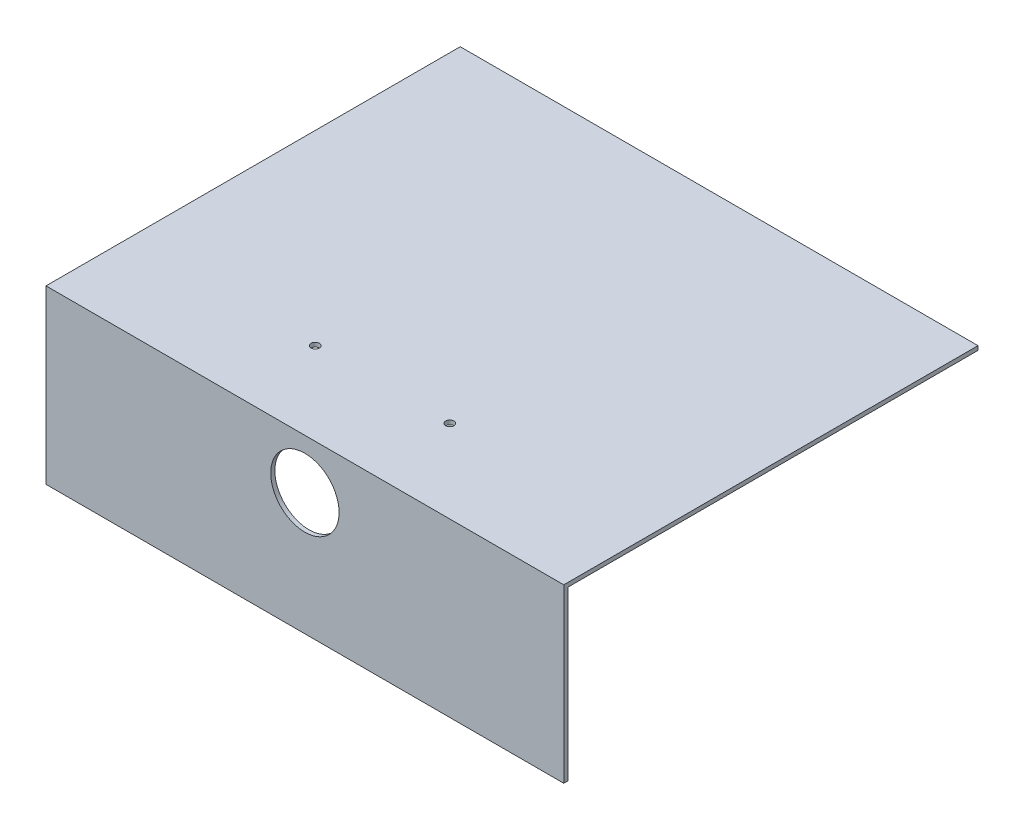
ISO-10303-21;
HEADER;
FILE_DESCRIPTION(('STEP AP214'),'2;1');
FILE_NAME('part.step','',(''),(''),'','','');
FILE_SCHEMA(('AUTOMOTIVE_DESIGN { 1 0 10303 214 1 1 1 1 }'));
ENDSEC;
DATA;
#1=APPLICATION_CONTEXT('core data for automotive mechanical design processes');
#2=APPLICATION_PROTOCOL_DEFINITION('international standard','automotive_design',2000,#1);
#3=PRODUCT_CONTEXT('',#1,'mechanical');
#4=PRODUCT('Part','Part','',(#3));
#5=PRODUCT_RELATED_PRODUCT_CATEGORY('part','',(#4));
#6=PRODUCT_DEFINITION_FORMATION('','',#4);
#7=PRODUCT_DEFINITION_CONTEXT('part definition',#1,'design');
#8=PRODUCT_DEFINITION('design','',#6,#7);
#9=PRODUCT_DEFINITION_SHAPE('','',#8);
#10=(LENGTH_UNIT() NAMED_UNIT(*) SI_UNIT(.MILLI.,.METRE.));
#11=(NAMED_UNIT(*) PLANE_ANGLE_UNIT() SI_UNIT($,.RADIAN.));
#12=(NAMED_UNIT(*) SI_UNIT($,.STERADIAN.) SOLID_ANGLE_UNIT());
#13=UNCERTAINTY_MEASURE_WITH_UNIT(LENGTH_MEASURE(1.E-05),#10,'distance_accuracy_value','');
#14=(GEOMETRIC_REPRESENTATION_CONTEXT(3) GLOBAL_UNCERTAINTY_ASSIGNED_CONTEXT((#13)) GLOBAL_UNIT_ASSIGNED_CONTEXT((#10,
#11,#12)) REPRESENTATION_CONTEXT('',''));
#15=CARTESIAN_POINT('',(0.,0.,0.));
#16=DIRECTION('',(0.,0.,1.));
#17=DIRECTION('',(1.,0.,0.));
#18=AXIS2_PLACEMENT_3D('',#15,#16,#17);
#19=CARTESIAN_POINT('',(0.,2.,0.));
#20=DIRECTION('',(1.,0.,0.));
#21=DIRECTION('',(0.,0.,-1.));
#22=AXIS2_PLACEMENT_3D('',#19,#20,#21);
#23=PLANE('',#22);
#24=DIRECTION('',(0.,0.,1.));
#25=VECTOR('',#24,1.);
#26=CARTESIAN_POINT('',(0.,0.,0.));
#27=LINE('',#26,#25);
#28=CARTESIAN_POINT('',(0.,0.,-200.));
#29=VERTEX_POINT('',#28);
#30=CARTESIAN_POINT('',(0.,0.,-2.));
#31=VERTEX_POINT('',#30);
#32=EDGE_CURVE('E117',#29,#31,#27,.T.);
#33=ORIENTED_EDGE('',*,*,#32,.T.);
#34=DIRECTION('',(0.,1.,0.));
#35=VECTOR('',#34,1.);
#36=CARTESIAN_POINT('',(0.,-81.,-2.));
#37=LINE('',#36,#35);
#38=CARTESIAN_POINT('',(0.,-81.,-2.));
#39=VERTEX_POINT('',#38);
#40=EDGE_CURVE('E100',#39,#31,#37,.T.);
#41=ORIENTED_EDGE('',*,*,#40,.F.);
#42=DIRECTION('',(0.,0.,-1.));
#43=VECTOR('',#42,1.);
#44=CARTESIAN_POINT('',(0.,-81.,0.));
#45=LINE('',#44,#43);
#46=CARTESIAN_POINT('',(0.,-81.,0.));
#47=VERTEX_POINT('',#46);
#48=EDGE_CURVE('E107',#47,#39,#45,.T.);
#49=ORIENTED_EDGE('',*,*,#48,.F.);
#50=DIRECTION('',(0.,-1.,0.));
#51=VECTOR('',#50,1.);
#52=CARTESIAN_POINT('',(0.,2.,0.));
#53=LINE('',#52,#51);
#54=CARTESIAN_POINT('',(0.,2.,0.));
#55=VERTEX_POINT('',#54);
#56=EDGE_CURVE('E11',#55,#47,#53,.T.);
#57=ORIENTED_EDGE('',*,*,#56,.F.);
#58=DIRECTION('',(0.,0.,1.));
#59=VECTOR('',#58,1.);
#60=CARTESIAN_POINT('',(0.,2.,0.));
#61=LINE('',#60,#59);
#62=CARTESIAN_POINT('',(0.,2.,-200.));
#63=VERTEX_POINT('',#62);
#64=EDGE_CURVE('E124',#63,#55,#61,.T.);
#65=ORIENTED_EDGE('',*,*,#64,.F.);
#66=DIRECTION('',(0.,-1.,0.));
#67=VECTOR('',#66,1.);
#68=CARTESIAN_POINT('',(0.,2.,-200.));
#69=LINE('',#68,#67);
#70=EDGE_CURVE('E129',#63,#29,#69,.T.);
#71=ORIENTED_EDGE('',*,*,#70,.T.);
#72=EDGE_LOOP('',(#33,#41,#49,#57,#65,#71));
#73=FACE_BOUND('',#72,.T.);
#74=ADVANCED_FACE('F33',(#73),#23,.F.);
#75=CARTESIAN_POINT('',(0.,2.,0.));
#76=DIRECTION('',(0.,0.,-1.));
#77=DIRECTION('',(-1.,0.,0.));
#78=AXIS2_PLACEMENT_3D('',#75,#76,#77);
#79=PLANE('',#78);
#80=CARTESIAN_POINT('',(125.,-22.,0.));
#81=DIRECTION('',(0.,0.,1.));
#82=DIRECTION('',(1.,0.,0.));
#83=AXIS2_PLACEMENT_3D('',#80,#81,#82);
#84=CIRCLE('',#83,16.5);
#85=CARTESIAN_POINT('',(141.5,-22.,0.));
#86=VERTEX_POINT('',#85);
#87=EDGE_CURVE('E182',#86,#86,#84,.T.);
#88=ORIENTED_EDGE('',*,*,#87,.F.);
#89=EDGE_LOOP('',(#88));
#90=FACE_BOUND('',#89,.T.);
#91=ORIENTED_EDGE('',*,*,#56,.T.);
#92=DIRECTION('',(-1.,0.,0.));
#93=VECTOR('',#92,1.);
#94=CARTESIAN_POINT('',(0.,-81.,0.));
#95=LINE('',#94,#93);
#96=CARTESIAN_POINT('',(250.,-81.,0.));
#97=VERTEX_POINT('',#96);
#98=EDGE_CURVE('E113',#97,#47,#95,.T.);
#99=ORIENTED_EDGE('',*,*,#98,.F.);
#100=DIRECTION('',(0.,-1.,0.));
#101=VECTOR('',#100,1.);
#102=CARTESIAN_POINT('',(250.,2.,0.));
#103=LINE('',#102,#101);
#104=CARTESIAN_POINT('',(250.,2.,0.));
#105=VERTEX_POINT('',#104);
#106=EDGE_CURVE('E41',#105,#97,#103,.T.);
#107=ORIENTED_EDGE('',*,*,#106,.F.);
#108=DIRECTION('',(1.,0.,0.));
#109=VECTOR('',#108,1.);
#110=CARTESIAN_POINT('',(0.,2.,0.));
#111=LINE('',#110,#109);
#112=EDGE_CURVE('E80',#55,#105,#111,.T.);
#113=ORIENTED_EDGE('',*,*,#112,.F.);
#114=EDGE_LOOP('',(#91,#99,#107,#113));
#115=FACE_BOUND('',#114,.T.);
#116=ADVANCED_FACE('F158',(#90,#115),#79,.F.);
#117=CARTESIAN_POINT('',(250.,2.,0.));
#118=DIRECTION('',(-1.,0.,0.));
#119=DIRECTION('',(0.,0.,1.));
#120=AXIS2_PLACEMENT_3D('',#117,#118,#119);
#121=PLANE('',#120);
#122=ORIENTED_EDGE('',*,*,#106,.T.);
#123=DIRECTION('',(0.,0.,1.));
#124=VECTOR('',#123,1.);
#125=CARTESIAN_POINT('',(250.,-81.,0.));
#126=LINE('',#125,#124);
#127=CARTESIAN_POINT('',(250.,-81.,-2.));
#128=VERTEX_POINT('',#127);
#129=EDGE_CURVE('E106',#128,#97,#126,.T.);
#130=ORIENTED_EDGE('',*,*,#129,.F.);
#131=DIRECTION('',(0.,1.,0.));
#132=VECTOR('',#131,1.);
#133=CARTESIAN_POINT('',(250.,-81.,-2.));
#134=LINE('',#133,#132);
#135=CARTESIAN_POINT('',(250.,0.,-2.));
#136=VERTEX_POINT('',#135);
#137=EDGE_CURVE('E102',#128,#136,#134,.T.);
#138=ORIENTED_EDGE('',*,*,#137,.T.);
#139=DIRECTION('',(0.,0.,-1.));
#140=VECTOR('',#139,1.);
#141=CARTESIAN_POINT('',(250.,0.,0.));
#142=LINE('',#141,#140);
#143=CARTESIAN_POINT('',(250.,0.,-200.));
#144=VERTEX_POINT('',#143);
#145=EDGE_CURVE('E119',#136,#144,#142,.T.);
#146=ORIENTED_EDGE('',*,*,#145,.T.);
#147=DIRECTION('',(0.,-1.,0.));
#148=VECTOR('',#147,1.);
#149=CARTESIAN_POINT('',(250.,2.,-200.));
#150=LINE('',#149,#148);
#151=CARTESIAN_POINT('',(250.,2.,-200.));
#152=VERTEX_POINT('',#151);
#153=EDGE_CURVE('E134',#152,#144,#150,.T.);
#154=ORIENTED_EDGE('',*,*,#153,.F.);
#155=DIRECTION('',(0.,0.,-1.));
#156=VECTOR('',#155,1.);
#157=CARTESIAN_POINT('',(250.,2.,0.));
#158=LINE('',#157,#156);
#159=EDGE_CURVE('E127',#105,#152,#158,.T.);
#160=ORIENTED_EDGE('',*,*,#159,.F.);
#161=EDGE_LOOP('',(#122,#130,#138,#146,#154,#160));
#162=FACE_BOUND('',#161,.T.);
#163=ADVANCED_FACE('F155',(#162),#121,.F.);
#164=CARTESIAN_POINT('',(0.,2.,-200.));
#165=DIRECTION('',(0.,0.,1.));
#166=DIRECTION('',(1.,0.,0.));
#167=AXIS2_PLACEMENT_3D('',#164,#165,#166);
#168=PLANE('',#167);
#169=DIRECTION('',(-1.,0.,0.));
#170=VECTOR('',#169,1.);
#171=CARTESIAN_POINT('',(0.,0.,-200.));
#172=LINE('',#171,#170);
#173=EDGE_CURVE('E73',#144,#29,#172,.T.);
#174=ORIENTED_EDGE('',*,*,#173,.T.);
#175=ORIENTED_EDGE('',*,*,#70,.F.);
#176=DIRECTION('',(-1.,0.,0.));
#177=VECTOR('',#176,1.);
#178=CARTESIAN_POINT('',(0.,2.,-200.));
#179=LINE('',#178,#177);
#180=EDGE_CURVE('E58',#152,#63,#179,.T.);
#181=ORIENTED_EDGE('',*,*,#180,.F.);
#182=ORIENTED_EDGE('',*,*,#153,.T.);
#183=EDGE_LOOP('',(#174,#175,#181,#182));
#184=FACE_BOUND('',#183,.T.);
#185=ADVANCED_FACE('F161',(#184),#168,.F.);
#186=CARTESIAN_POINT('',(0.,2.,0.));
#187=DIRECTION('',(0.,-1.,0.));
#188=DIRECTION('',(0.,0.,-1.));
#189=AXIS2_PLACEMENT_3D('',#186,#187,#188);
#190=PLANE('',#189);
#191=CARTESIAN_POINT('',(155.,2.,-40.));
#192=DIRECTION('',(0.,1.,0.));
#193=DIRECTION('',(0.,0.,1.));
#194=AXIS2_PLACEMENT_3D('',#191,#192,#193);
#195=CIRCLE('',#194,2.);
#196=CARTESIAN_POINT('',(155.,2.,-38.));
#197=VERTEX_POINT('',#196);
#198=EDGE_CURVE('E138',#197,#197,#195,.T.);
#199=ORIENTED_EDGE('',*,*,#198,.F.);
#200=EDGE_LOOP('',(#199));
#201=FACE_BOUND('',#200,.T.);
#202=CARTESIAN_POINT('',(90.,2.,-40.));
#203=DIRECTION('',(0.,1.,0.));
#204=DIRECTION('',(0.,0.,1.));
#205=AXIS2_PLACEMENT_3D('',#202,#203,#204);
#206=CIRCLE('',#205,2.);
#207=CARTESIAN_POINT('',(90.,2.,-38.));
#208=VERTEX_POINT('',#207);
#209=EDGE_CURVE('E143',#208,#208,#206,.T.);
#210=ORIENTED_EDGE('',*,*,#209,.F.);
#211=EDGE_LOOP('',(#210));
#212=FACE_BOUND('',#211,.T.);
#213=ORIENTED_EDGE('',*,*,#64,.T.);
#214=ORIENTED_EDGE('',*,*,#112,.T.);
#215=ORIENTED_EDGE('',*,*,#159,.T.);
#216=ORIENTED_EDGE('',*,*,#180,.T.);
#217=EDGE_LOOP('',(#213,#214,#215,#216));
#218=FACE_BOUND('',#217,.T.);
#219=ADVANCED_FACE('F160',(#201,#212,#218),#190,.F.);
#220=CARTESIAN_POINT('',(0.,0.,0.));
#221=DIRECTION('',(0.,-1.,0.));
#222=DIRECTION('',(0.,0.,-1.));
#223=AXIS2_PLACEMENT_3D('',#220,#221,#222);
#224=PLANE('',#223);
#225=CARTESIAN_POINT('',(155.,0.,-40.));
#226=DIRECTION('',(0.,-1.,0.));
#227=DIRECTION('',(0.,0.,-1.));
#228=AXIS2_PLACEMENT_3D('',#225,#226,#227);
#229=CIRCLE('',#228,2.);
#230=CARTESIAN_POINT('',(155.,0.,-42.));
#231=VERTEX_POINT('',#230);
#232=EDGE_CURVE('E36',#231,#231,#229,.T.);
#233=ORIENTED_EDGE('',*,*,#232,.F.);
#234=EDGE_LOOP('',(#233));
#235=FACE_BOUND('',#234,.T.);
#236=CARTESIAN_POINT('',(90.,0.,-40.));
#237=DIRECTION('',(0.,-1.,0.));
#238=DIRECTION('',(0.,0.,-1.));
#239=AXIS2_PLACEMENT_3D('',#236,#237,#238);
#240=CIRCLE('',#239,2.);
#241=CARTESIAN_POINT('',(90.,0.,-42.));
#242=VERTEX_POINT('',#241);
#243=EDGE_CURVE('E136',#242,#242,#240,.T.);
#244=ORIENTED_EDGE('',*,*,#243,.F.);
#245=EDGE_LOOP('',(#244));
#246=FACE_BOUND('',#245,.T.);
#247=DIRECTION('',(1.,0.,0.));
#248=VECTOR('',#247,1.);
#249=CARTESIAN_POINT('',(0.,0.,-2.));
#250=LINE('',#249,#248);
#251=EDGE_CURVE('E49',#31,#136,#250,.T.);
#252=ORIENTED_EDGE('',*,*,#251,.F.);
#253=ORIENTED_EDGE('',*,*,#32,.F.);
#254=ORIENTED_EDGE('',*,*,#173,.F.);
#255=ORIENTED_EDGE('',*,*,#145,.F.);
#256=EDGE_LOOP('',(#252,#253,#254,#255));
#257=FACE_BOUND('',#256,.T.);
#258=ADVANCED_FACE('F168',(#235,#246,#257),#224,.T.);
#259=CARTESIAN_POINT('',(0.,-81.,-2.));
#260=DIRECTION('',(0.,0.,1.));
#261=DIRECTION('',(1.,0.,0.));
#262=AXIS2_PLACEMENT_3D('',#259,#260,#261);
#263=PLANE('',#262);
#264=CARTESIAN_POINT('',(125.,-22.,-2.));
#265=DIRECTION('',(0.,0.,1.));
#266=DIRECTION('',(1.,0.,0.));
#267=AXIS2_PLACEMENT_3D('',#264,#265,#266);
#268=CIRCLE('',#267,16.5);
#269=CARTESIAN_POINT('',(141.5,-22.,-2.));
#270=VERTEX_POINT('',#269);
#271=EDGE_CURVE('E148',#270,#270,#268,.F.);
#272=ORIENTED_EDGE('',*,*,#271,.F.);
#273=EDGE_LOOP('',(#272));
#274=FACE_BOUND('',#273,.T.);
#275=ORIENTED_EDGE('',*,*,#251,.T.);
#276=ORIENTED_EDGE('',*,*,#137,.F.);
#277=DIRECTION('',(1.,0.,0.));
#278=VECTOR('',#277,1.);
#279=CARTESIAN_POINT('',(0.,-81.,-2.));
#280=LINE('',#279,#278);
#281=EDGE_CURVE('E96',#39,#128,#280,.T.);
#282=ORIENTED_EDGE('',*,*,#281,.F.);
#283=ORIENTED_EDGE('',*,*,#40,.T.);
#284=EDGE_LOOP('',(#275,#276,#282,#283));
#285=FACE_BOUND('',#284,.T.);
#286=ADVANCED_FACE('F98',(#274,#285),#263,.F.);
#287=CARTESIAN_POINT('',(0.,-81.,0.));
#288=DIRECTION('',(0.,-1.,0.));
#289=DIRECTION('',(0.,0.,-1.));
#290=AXIS2_PLACEMENT_3D('',#287,#288,#289);
#291=PLANE('',#290);
#292=ORIENTED_EDGE('',*,*,#48,.T.);
#293=ORIENTED_EDGE('',*,*,#281,.T.);
#294=ORIENTED_EDGE('',*,*,#129,.T.);
#295=ORIENTED_EDGE('',*,*,#98,.T.);
#296=EDGE_LOOP('',(#292,#293,#294,#295));
#297=FACE_BOUND('',#296,.T.);
#298=ADVANCED_FACE('F111',(#297),#291,.T.);
#299=CARTESIAN_POINT('',(90.,-81.,-40.));
#300=DIRECTION('',(0.,1.,0.));
#301=DIRECTION('',(0.,0.,1.));
#302=AXIS2_PLACEMENT_3D('',#299,#300,#301);
#303=CYLINDRICAL_SURFACE('',#302,2.);
#304=ORIENTED_EDGE('',*,*,#243,.T.);
#305=EDGE_LOOP('',(#304));
#306=FACE_BOUND('',#305,.T.);
#307=ORIENTED_EDGE('',*,*,#209,.T.);
#308=EDGE_LOOP('',(#307));
#309=FACE_BOUND('',#308,.T.);
#310=ADVANCED_FACE('F195',(#306,#309),#303,.F.);
#311=CARTESIAN_POINT('',(155.,-81.,-40.));
#312=DIRECTION('',(0.,1.,0.));
#313=DIRECTION('',(0.,0.,1.));
#314=AXIS2_PLACEMENT_3D('',#311,#312,#313);
#315=CYLINDRICAL_SURFACE('',#314,2.);
#316=ORIENTED_EDGE('',*,*,#232,.T.);
#317=EDGE_LOOP('',(#316));
#318=FACE_BOUND('',#317,.T.);
#319=ORIENTED_EDGE('',*,*,#198,.T.);
#320=EDGE_LOOP('',(#319));
#321=FACE_BOUND('',#320,.T.);
#322=ADVANCED_FACE('F201',(#318,#321),#315,.F.);
#323=CARTESIAN_POINT('',(125.,-22.,-200.001));
#324=DIRECTION('',(0.,0.,1.));
#325=DIRECTION('',(1.,0.,0.));
#326=AXIS2_PLACEMENT_3D('',#323,#324,#325);
#327=CYLINDRICAL_SURFACE('',#326,16.5);
#328=CARTESIAN_POINT('',(141.5,-22.,0.));
#329=CARTESIAN_POINT('',(141.5,-22.,-0.020833333333331));
#330=CARTESIAN_POINT('',(141.5,-22.,-0.0416666666666621));
#331=CARTESIAN_POINT('',(141.5,-22.,-0.0833333333333242));
#332=CARTESIAN_POINT('',(141.5,-22.,-0.104166666666655));
#333=CARTESIAN_POINT('',(141.5,-22.,-0.145833333333327));
#334=CARTESIAN_POINT('',(141.5,-22.,-0.166666666666667));
#335=CARTESIAN_POINT('',(141.5,-22.,-0.208333333333338));
#336=CARTESIAN_POINT('',(141.5,-22.,-0.229166666666669));
#337=CARTESIAN_POINT('',(141.5,-22.,-0.270833333333331));
#338=CARTESIAN_POINT('',(141.5,-22.,-0.291666666666662));
#339=CARTESIAN_POINT('',(141.5,-22.,-0.333333333333334));
#340=CARTESIAN_POINT('',(141.5,-22.,-0.354166666666674));
#341=CARTESIAN_POINT('',(141.5,-22.,-0.395833333333345));
#342=CARTESIAN_POINT('',(141.5,-22.,-0.416666666666676));
#343=CARTESIAN_POINT('',(141.5,-22.,-0.458333333333338));
#344=CARTESIAN_POINT('',(141.5,-22.,-0.479166666666669));
#345=CARTESIAN_POINT('',(141.5,-22.,-0.520833333333331));
#346=CARTESIAN_POINT('',(141.5,-22.,-0.541666666666663));
#347=CARTESIAN_POINT('',(141.5,-22.,-0.583333333333325));
#348=CARTESIAN_POINT('',(141.5,-22.,-0.604166666666656));
#349=CARTESIAN_POINT('',(141.5,-22.,-0.645833333333327));
#350=CARTESIAN_POINT('',(141.5,-22.,-0.666666666666667));
#351=CARTESIAN_POINT('',(141.5,-22.,-0.708333333333339));
#352=CARTESIAN_POINT('',(141.5,-22.,-0.72916666666667));
#353=CARTESIAN_POINT('',(141.5,-22.,-0.770833333333332));
#354=CARTESIAN_POINT('',(141.5,-22.,-0.791666666666663));
#355=CARTESIAN_POINT('',(141.5,-22.,-0.833333333333334));
#356=CARTESIAN_POINT('',(141.5,-22.,-0.854166666666674));
#357=CARTESIAN_POINT('',(141.5,-22.,-0.895833333333346));
#358=CARTESIAN_POINT('',(141.5,-22.,-0.916666666666677));
#359=CARTESIAN_POINT('',(141.5,-22.,-0.958333333333339));
#360=CARTESIAN_POINT('',(141.5,-22.,-0.97916666666667));
#361=CARTESIAN_POINT('',(141.5,-22.,-1.02083333333333));
#362=CARTESIAN_POINT('',(141.5,-22.,-1.04166666666666));
#363=CARTESIAN_POINT('',(141.5,-22.,-1.08333333333333));
#364=CARTESIAN_POINT('',(141.5,-22.,-1.10416666666666));
#365=CARTESIAN_POINT('',(141.5,-22.,-1.14583333333333));
#366=CARTESIAN_POINT('',(141.5,-22.,-1.16666666666667));
#367=CARTESIAN_POINT('',(141.5,-22.,-1.20833333333334));
#368=CARTESIAN_POINT('',(141.5,-22.,-1.22916666666667));
#369=CARTESIAN_POINT('',(141.5,-22.,-1.27083333333333));
#370=CARTESIAN_POINT('',(141.5,-22.,-1.29166666666666));
#371=CARTESIAN_POINT('',(141.5,-22.,-1.33333333333333));
#372=CARTESIAN_POINT('',(141.5,-22.,-1.35416666666667));
#373=CARTESIAN_POINT('',(141.5,-22.,-1.39583333333335));
#374=CARTESIAN_POINT('',(141.5,-22.,-1.41666666666668));
#375=CARTESIAN_POINT('',(141.5,-22.,-1.45833333333334));
#376=CARTESIAN_POINT('',(141.5,-22.,-1.47916666666667));
#377=CARTESIAN_POINT('',(141.5,-22.,-1.52083333333333));
#378=CARTESIAN_POINT('',(141.5,-22.,-1.54166666666666));
#379=CARTESIAN_POINT('',(141.5,-22.,-1.58333333333333));
#380=CARTESIAN_POINT('',(141.5,-22.,-1.60416666666666));
#381=CARTESIAN_POINT('',(141.5,-22.,-1.64583333333333));
#382=CARTESIAN_POINT('',(141.5,-22.,-1.66666666666667));
#383=CARTESIAN_POINT('',(141.5,-22.,-1.70833333333334));
#384=CARTESIAN_POINT('',(141.5,-22.,-1.72916666666667));
#385=CARTESIAN_POINT('',(141.5,-22.,-1.77083333333333));
#386=CARTESIAN_POINT('',(141.5,-22.,-1.79166666666666));
#387=CARTESIAN_POINT('',(141.5,-22.,-1.83333333333334));
#388=CARTESIAN_POINT('',(141.5,-22.,-1.85416666666668));
#389=CARTESIAN_POINT('',(141.5,-22.,-1.89583333333335));
#390=CARTESIAN_POINT('',(141.5,-22.,-1.91666666666668));
#391=CARTESIAN_POINT('',(141.5,-22.,-1.95833333333334));
#392=CARTESIAN_POINT('',(141.5,-22.,-1.97916666666667));
#393=CARTESIAN_POINT('',(141.5,-22.,-2.));
#394=B_SPLINE_CURVE_WITH_KNOTS('',3,(#328,#329,#330,#331,#332,#333,#334,#335,#336,#337,#338,
#339,#340,#341,#342,#343,#344,#345,#346,#347,#348,#349,#350,#351,#352,#353,#354,#355,#356,#357,
#358,#359,#360,#361,#362,#363,#364,#365,#366,#367,#368,#369,#370,#371,#372,#373,#374,#375,#376,
#377,#378,#379,#380,#381,#382,#383,#384,#385,#386,#387,#388,#389,#390,#391,#392,#393),
.UNSPECIFIED.,.F.,.F.,(4,2,2,2,2,2,2,2,2,2,2,2,2,2,2,2,2,2,2,2,2,2,2,2,2,2,2,2,2,2,2,2,4),(0.,
0.0624999999999931,0.124999999999986,0.187500000000007,0.25,0.312499999999993,0.375000000000014,
0.437500000000007,0.5,0.562499999999994,0.624999999999987,0.687500000000008,0.750000000000001,
0.812499999999994,0.875000000000015,0.937500000000008,1.,1.06249999999999,1.12499999999999,
1.18750000000001,1.25,1.31249999999999,1.37500000000002,1.43750000000001,1.5,1.56249999999999,
1.62499999999999,1.68750000000001,1.75,1.81249999999999,1.87500000000002,1.93750000000001,2.),.UNSPECIFIED.);
#395=EDGE_CURVE('BSEAM187',#86,#270,#394,.T.);
#396=ORIENTED_EDGE('',*,*,#87,.T.);
#397=ORIENTED_EDGE('',*,*,#271,.T.);
#398=ORIENTED_EDGE('',*,*,#395,.T.);
#399=ORIENTED_EDGE('',*,*,#395,.F.);
#400=EDGE_LOOP('',(#396,#398,#397,#399));
#401=FACE_BOUND('',#400,.T.);
#402=ADVANCED_FACE('F187',(#401),#327,.F.);
#403=CLOSED_SHELL('',(#74,#116,#163,#185,#219,#258,#286,#298,#310,#322,#402));
#404=MANIFOLD_SOLID_BREP('B2',#403);
#405=ADVANCED_BREP_SHAPE_REPRESENTATION('',(#18,#404),#14);
#406=SHAPE_DEFINITION_REPRESENTATION(#9,#405);
ENDSEC;
END-ISO-10303-21;
